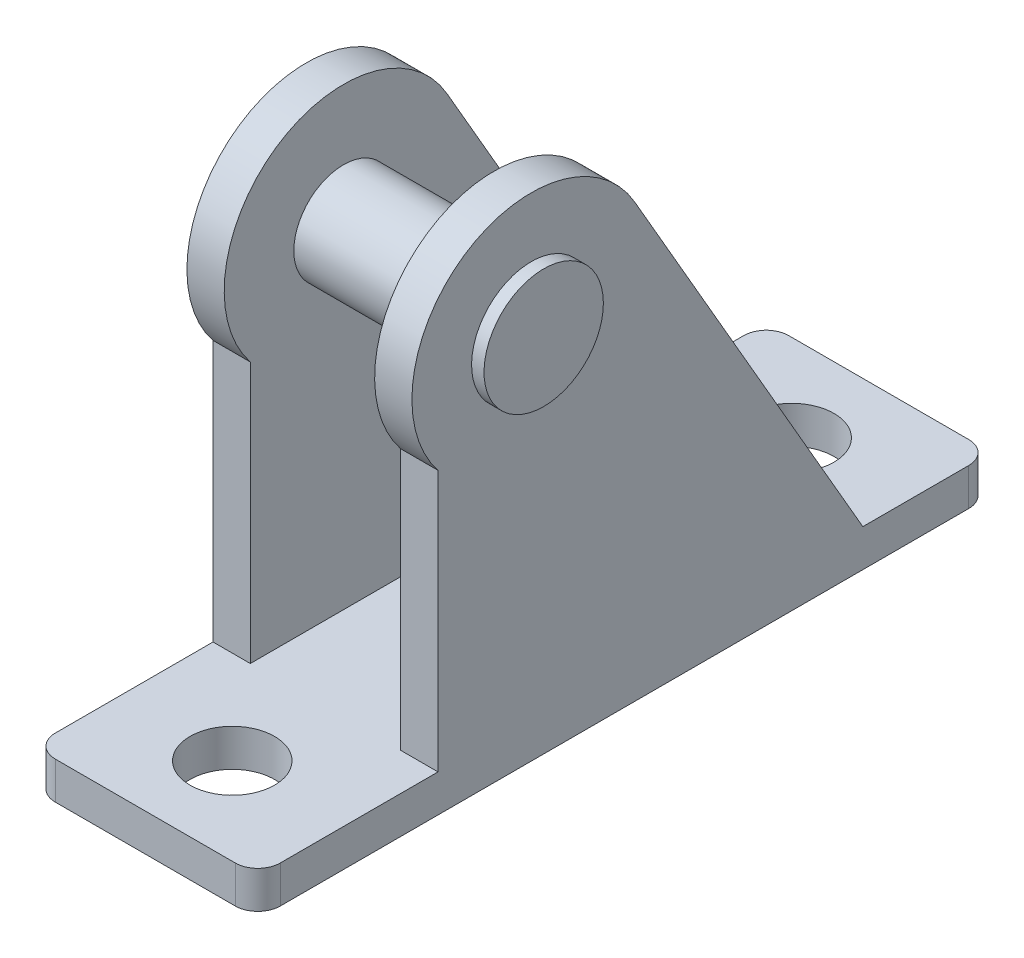
ISO-10303-21;
HEADER;
FILE_DESCRIPTION(('STEP AP214'),'2;1');
FILE_NAME('part.step','',(''),(''),'','','');
FILE_SCHEMA(('AUTOMOTIVE_DESIGN { 1 0 10303 214 1 1 1 1 }'));
ENDSEC;
DATA;
#1=APPLICATION_CONTEXT('core data for automotive mechanical design processes');
#2=APPLICATION_PROTOCOL_DEFINITION('international standard','automotive_design',2000,#1);
#3=PRODUCT_CONTEXT('',#1,'mechanical');
#4=PRODUCT('Part','Part','',(#3));
#5=PRODUCT_RELATED_PRODUCT_CATEGORY('part','',(#4));
#6=PRODUCT_DEFINITION_FORMATION('','',#4);
#7=PRODUCT_DEFINITION_CONTEXT('part definition',#1,'design');
#8=PRODUCT_DEFINITION('design','',#6,#7);
#9=PRODUCT_DEFINITION_SHAPE('','',#8);
#10=(LENGTH_UNIT() NAMED_UNIT(*) SI_UNIT(.MILLI.,.METRE.));
#11=(NAMED_UNIT(*) PLANE_ANGLE_UNIT() SI_UNIT($,.RADIAN.));
#12=(NAMED_UNIT(*) SI_UNIT($,.STERADIAN.) SOLID_ANGLE_UNIT());
#13=UNCERTAINTY_MEASURE_WITH_UNIT(LENGTH_MEASURE(1.E-05),#10,'distance_accuracy_value','');
#14=(GEOMETRIC_REPRESENTATION_CONTEXT(3) GLOBAL_UNCERTAINTY_ASSIGNED_CONTEXT((#13)) GLOBAL_UNIT_ASSIGNED_CONTEXT((#10,
#11,#12)) REPRESENTATION_CONTEXT('',''));
#15=CARTESIAN_POINT('',(0.,0.,0.));
#16=DIRECTION('',(0.,0.,1.));
#17=DIRECTION('',(1.,0.,0.));
#18=AXIS2_PLACEMENT_3D('',#15,#16,#17);
#19=CARTESIAN_POINT('',(9.05,0.,22.));
#20=DIRECTION('',(-1.,0.,0.));
#21=DIRECTION('',(0.,-1.,0.));
#22=AXIS2_PLACEMENT_3D('',#19,#20,#21);
#23=PLANE('',#22);
#24=DIRECTION('',(0.,0.,-1.));
#25=VECTOR('',#24,1.);
#26=CARTESIAN_POINT('',(9.05,0.,22.));
#27=LINE('',#26,#25);
#28=CARTESIAN_POINT('',(9.05,0.,20.19));
#29=VERTEX_POINT('',#28);
#30=CARTESIAN_POINT('',(9.05,0.,-35.19));
#31=VERTEX_POINT('',#30);
#32=EDGE_CURVE('E230',#29,#31,#27,.T.);
#33=ORIENTED_EDGE('',*,*,#32,.T.);
#34=DIRECTION('',(0.,1.,0.));
#35=VECTOR('',#34,1.);
#36=CARTESIAN_POINT('',(9.05,3.,-35.19));
#37=LINE('',#36,#35);
#38=CARTESIAN_POINT('',(9.05,3.,-35.19));
#39=VERTEX_POINT('',#38);
#40=EDGE_CURVE('E270',#31,#39,#37,.T.);
#41=ORIENTED_EDGE('',*,*,#40,.T.);
#42=DIRECTION('',(0.,0.,-1.));
#43=VECTOR('',#42,1.);
#44=CARTESIAN_POINT('',(9.05,3.,-26.6735824365608));
#45=LINE('',#44,#43);
#46=CARTESIAN_POINT('',(9.05,3.,-26.6735824365608));
#47=VERTEX_POINT('',#46);
#48=EDGE_CURVE('E192',#47,#39,#45,.T.);
#49=ORIENTED_EDGE('',*,*,#48,.F.);
#50=DIRECTION('',(0.,-0.866025403784438,-0.500000000000001));
#51=VECTOR('',#50,1.);
#52=CARTESIAN_POINT('',(9.05,34.8,-8.31384387633061));
#53=LINE('',#52,#51);
#54=CARTESIAN_POINT('',(9.05,34.8,-8.31384387633061));
#55=VERTEX_POINT('',#54);
#56=EDGE_CURVE('E189',#55,#47,#53,.T.);
#57=ORIENTED_EDGE('',*,*,#56,.F.);
#58=CARTESIAN_POINT('',(9.05,30.,0.));
#59=DIRECTION('',(-1.,0.,0.));
#60=DIRECTION('',(0.,0.,-1.));
#61=AXIS2_PLACEMENT_3D('',#58,#59,#60);
#62=CIRCLE('',#61,9.6);
#63=CARTESIAN_POINT('',(9.05,24.0075046933685,7.5));
#64=VERTEX_POINT('',#63);
#65=EDGE_CURVE('E186',#64,#55,#62,.T.);
#66=ORIENTED_EDGE('',*,*,#65,.F.);
#67=DIRECTION('',(0.,1.,0.));
#68=VECTOR('',#67,1.);
#69=CARTESIAN_POINT('',(9.05,24.0075046933685,7.5));
#70=LINE('',#69,#68);
#71=CARTESIAN_POINT('',(9.05,3.,7.5));
#72=VERTEX_POINT('',#71);
#73=EDGE_CURVE('E173',#72,#64,#70,.T.);
#74=ORIENTED_EDGE('',*,*,#73,.F.);
#75=DIRECTION('',(0.,0.,-1.));
#76=VECTOR('',#75,1.);
#77=CARTESIAN_POINT('',(9.05,3.,7.5));
#78=LINE('',#77,#76);
#79=CARTESIAN_POINT('',(9.05,3.,20.19));
#80=VERTEX_POINT('',#79);
#81=EDGE_CURVE('E176',#80,#72,#78,.T.);
#82=ORIENTED_EDGE('',*,*,#81,.F.);
#83=DIRECTION('',(0.,1.,0.));
#84=VECTOR('',#83,1.);
#85=CARTESIAN_POINT('',(9.05,0.,20.19));
#86=LINE('',#85,#84);
#87=EDGE_CURVE('E268',#80,#29,#86,.F.);
#88=ORIENTED_EDGE('',*,*,#87,.T.);
#89=EDGE_LOOP('',(#33,#41,#49,#57,#66,#74,#82,#88));
#90=FACE_BOUND('',#89,.T.);
#91=CARTESIAN_POINT('',(9.05,30.,0.));
#92=DIRECTION('',(-1.,0.,0.));
#93=DIRECTION('',(0.,-1.,0.));
#94=AXIS2_PLACEMENT_3D('',#91,#92,#93);
#95=CIRCLE('',#94,4.8);
#96=CARTESIAN_POINT('',(9.05,25.2,0.));
#97=VERTEX_POINT('',#96);
#98=EDGE_CURVE('E242',#97,#97,#95,.F.);
#99=ORIENTED_EDGE('',*,*,#98,.F.);
#100=EDGE_LOOP('',(#99));
#101=FACE_BOUND('',#100,.T.);
#102=ADVANCED_FACE('F32',(#90,#101),#23,.F.);
#103=CARTESIAN_POINT('',(-9.05,0.,22.));
#104=DIRECTION('',(1.,0.,0.));
#105=DIRECTION('',(0.,1.,0.));
#106=AXIS2_PLACEMENT_3D('',#103,#104,#105);
#107=PLANE('',#106);
#108=CARTESIAN_POINT('',(-9.05,30.,0.));
#109=DIRECTION('',(1.,0.,0.));
#110=DIRECTION('',(0.,0.,-1.));
#111=AXIS2_PLACEMENT_3D('',#108,#109,#110);
#112=CIRCLE('',#111,4.8);
#113=CARTESIAN_POINT('',(-9.05,30.,-4.8));
#114=VERTEX_POINT('',#113);
#115=EDGE_CURVE('E559',#114,#114,#112,.T.);
#116=ORIENTED_EDGE('',*,*,#115,.T.);
#117=EDGE_LOOP('',(#116));
#118=FACE_BOUND('',#117,.T.);
#119=DIRECTION('',(0.,0.,-1.));
#120=VECTOR('',#119,1.);
#121=CARTESIAN_POINT('',(-9.05,3.,-26.6735824365608));
#122=LINE('',#121,#120);
#123=CARTESIAN_POINT('',(-9.05,3.,-26.6735824365608));
#124=VERTEX_POINT('',#123);
#125=CARTESIAN_POINT('',(-9.05,3.,-35.19));
#126=VERTEX_POINT('',#125);
#127=EDGE_CURVE('E168',#124,#126,#122,.T.);
#128=ORIENTED_EDGE('',*,*,#127,.T.);
#129=DIRECTION('',(0.,-1.,0.));
#130=VECTOR('',#129,1.);
#131=CARTESIAN_POINT('',(-9.05,0.,-35.19));
#132=LINE('',#131,#130);
#133=CARTESIAN_POINT('',(-9.05,0.,-35.19));
#134=VERTEX_POINT('',#133);
#135=EDGE_CURVE('E247',#126,#134,#132,.T.);
#136=ORIENTED_EDGE('',*,*,#135,.T.);
#137=DIRECTION('',(0.,0.,-1.));
#138=VECTOR('',#137,1.);
#139=CARTESIAN_POINT('',(-9.05,0.,22.));
#140=LINE('',#139,#138);
#141=CARTESIAN_POINT('',(-9.05,0.,20.19));
#142=VERTEX_POINT('',#141);
#143=EDGE_CURVE('E233',#142,#134,#140,.T.);
#144=ORIENTED_EDGE('',*,*,#143,.F.);
#145=DIRECTION('',(0.,-1.,0.));
#146=VECTOR('',#145,1.);
#147=CARTESIAN_POINT('',(-9.05,0.,20.19));
#148=LINE('',#147,#146);
#149=CARTESIAN_POINT('',(-9.05,3.,20.19));
#150=VERTEX_POINT('',#149);
#151=EDGE_CURVE('E245',#142,#150,#148,.F.);
#152=ORIENTED_EDGE('',*,*,#151,.T.);
#153=DIRECTION('',(0.,0.,-1.));
#154=VECTOR('',#153,1.);
#155=CARTESIAN_POINT('',(-9.05,3.,7.5));
#156=LINE('',#155,#154);
#157=CARTESIAN_POINT('',(-9.05,3.,7.5));
#158=VERTEX_POINT('',#157);
#159=EDGE_CURVE('E183',#150,#158,#156,.T.);
#160=ORIENTED_EDGE('',*,*,#159,.T.);
#161=DIRECTION('',(0.,1.,0.));
#162=VECTOR('',#161,1.);
#163=CARTESIAN_POINT('',(-9.05,24.0075046933685,7.5));
#164=LINE('',#163,#162);
#165=CARTESIAN_POINT('',(-9.05,24.0075046933685,7.5));
#166=VERTEX_POINT('',#165);
#167=EDGE_CURVE('E172',#158,#166,#164,.T.);
#168=ORIENTED_EDGE('',*,*,#167,.T.);
#169=CARTESIAN_POINT('',(-9.05,30.,0.));
#170=DIRECTION('',(-1.,0.,0.));
#171=DIRECTION('',(0.,0.,-1.));
#172=AXIS2_PLACEMENT_3D('',#169,#170,#171);
#173=CIRCLE('',#172,9.6);
#174=CARTESIAN_POINT('',(-9.05,34.8,-8.31384387633061));
#175=VERTEX_POINT('',#174);
#176=EDGE_CURVE('E151',#166,#175,#173,.T.);
#177=ORIENTED_EDGE('',*,*,#176,.T.);
#178=DIRECTION('',(0.,-0.866025403784438,-0.500000000000001));
#179=VECTOR('',#178,1.);
#180=CARTESIAN_POINT('',(-9.05,34.8,-8.31384387633061));
#181=LINE('',#180,#179);
#182=EDGE_CURVE('E161',#175,#124,#181,.T.);
#183=ORIENTED_EDGE('',*,*,#182,.T.);
#184=EDGE_LOOP('',(#128,#136,#144,#152,#160,#168,#177,#183));
#185=FACE_BOUND('',#184,.T.);
#186=ADVANCED_FACE('F170',(#118,#185),#107,.F.);
#187=CARTESIAN_POINT('',(-9.05,0.,22.));
#188=DIRECTION('',(0.,1.,0.));
#189=DIRECTION('',(0.,0.,1.));
#190=AXIS2_PLACEMENT_3D('',#187,#188,#189);
#191=PLANE('',#190);
#192=CARTESIAN_POINT('',(0.,0.,-30.));
#193=DIRECTION('',(0.,1.,0.));
#194=DIRECTION('',(0.,0.,1.));
#195=AXIS2_PLACEMENT_3D('',#192,#193,#194);
#196=CIRCLE('',#195,3.4);
#197=CARTESIAN_POINT('',(0.,0.,-26.6));
#198=VERTEX_POINT('',#197);
#199=EDGE_CURVE('E568',#198,#198,#196,.T.);
#200=ORIENTED_EDGE('',*,*,#199,.T.);
#201=EDGE_LOOP('',(#200));
#202=FACE_BOUND('',#201,.T.);
#203=CARTESIAN_POINT('',(0.,0.,15.));
#204=DIRECTION('',(0.,1.,0.));
#205=DIRECTION('',(0.,0.,1.));
#206=AXIS2_PLACEMENT_3D('',#203,#204,#205);
#207=CIRCLE('',#206,3.4);
#208=CARTESIAN_POINT('',(0.,0.,18.4));
#209=VERTEX_POINT('',#208);
#210=EDGE_CURVE('E562',#209,#209,#207,.T.);
#211=ORIENTED_EDGE('',*,*,#210,.T.);
#212=EDGE_LOOP('',(#211));
#213=FACE_BOUND('',#212,.T.);
#214=ORIENTED_EDGE('',*,*,#143,.T.);
#215=CARTESIAN_POINT('',(-7.24,0.,-35.19));
#216=DIRECTION('',(0.,1.,0.));
#217=DIRECTION('',(0.,0.,1.));
#218=AXIS2_PLACEMENT_3D('',#215,#216,#217);
#219=CIRCLE('',#218,1.81);
#220=CARTESIAN_POINT('',(-7.24,0.,-37.));
#221=VERTEX_POINT('',#220);
#222=EDGE_CURVE('E256',#134,#221,#219,.F.);
#223=ORIENTED_EDGE('',*,*,#222,.T.);
#224=DIRECTION('',(1.,0.,0.));
#225=VECTOR('',#224,1.);
#226=CARTESIAN_POINT('',(-9.05,0.,-37.));
#227=LINE('',#226,#225);
#228=CARTESIAN_POINT('',(7.23999999999999,0.,-37.));
#229=VERTEX_POINT('',#228);
#230=EDGE_CURVE('E212',#221,#229,#227,.T.);
#231=ORIENTED_EDGE('',*,*,#230,.T.);
#232=CARTESIAN_POINT('',(7.24,0.,-35.19));
#233=DIRECTION('',(0.,1.,0.));
#234=DIRECTION('',(0.,0.,1.));
#235=AXIS2_PLACEMENT_3D('',#232,#233,#234);
#236=CIRCLE('',#235,1.81);
#237=EDGE_CURVE('E254',#229,#31,#236,.F.);
#238=ORIENTED_EDGE('',*,*,#237,.T.);
#239=ORIENTED_EDGE('',*,*,#32,.F.);
#240=CARTESIAN_POINT('',(7.24,0.,20.19));
#241=DIRECTION('',(0.,1.,0.));
#242=DIRECTION('',(0.,0.,1.));
#243=AXIS2_PLACEMENT_3D('',#240,#241,#242);
#244=CIRCLE('',#243,1.81);
#245=CARTESIAN_POINT('',(7.23999999999999,0.,22.));
#246=VERTEX_POINT('',#245);
#247=EDGE_CURVE('E250',#29,#246,#244,.F.);
#248=ORIENTED_EDGE('',*,*,#247,.T.);
#249=DIRECTION('',(1.,0.,0.));
#250=VECTOR('',#249,1.);
#251=CARTESIAN_POINT('',(-9.05,0.,22.));
#252=LINE('',#251,#250);
#253=CARTESIAN_POINT('',(-7.24,0.,22.));
#254=VERTEX_POINT('',#253);
#255=EDGE_CURVE('E213',#254,#246,#252,.T.);
#256=ORIENTED_EDGE('',*,*,#255,.F.);
#257=CARTESIAN_POINT('',(-7.24,0.,20.19));
#258=DIRECTION('',(0.,1.,0.));
#259=DIRECTION('',(0.,0.,1.));
#260=AXIS2_PLACEMENT_3D('',#257,#258,#259);
#261=CIRCLE('',#260,1.81);
#262=EDGE_CURVE('E252',#254,#142,#261,.F.);
#263=ORIENTED_EDGE('',*,*,#262,.T.);
#264=EDGE_LOOP('',(#214,#223,#231,#238,#239,#248,#256,#263));
#265=FACE_BOUND('',#264,.T.);
#266=ADVANCED_FACE('F287',(#202,#213,#265),#191,.F.);
#267=CARTESIAN_POINT('',(6.05,3.,22.));
#268=DIRECTION('',(1.,0.,0.));
#269=DIRECTION('',(0.,1.,0.));
#270=AXIS2_PLACEMENT_3D('',#267,#268,#269);
#271=PLANE('',#270);
#272=CARTESIAN_POINT('',(6.05000000000001,30.,0.));
#273=DIRECTION('',(1.,0.,0.));
#274=DIRECTION('',(0.,1.,0.));
#275=AXIS2_PLACEMENT_3D('',#272,#273,#274);
#276=CIRCLE('',#275,4.);
#277=CARTESIAN_POINT('',(6.05000000000001,34.,0.));
#278=VERTEX_POINT('',#277);
#279=EDGE_CURVE('E179',#278,#278,#276,.T.);
#280=ORIENTED_EDGE('',*,*,#279,.T.);
#281=EDGE_LOOP('',(#280));
#282=FACE_BOUND('',#281,.T.);
#283=DIRECTION('',(0.,0.,-1.));
#284=VECTOR('',#283,1.);
#285=CARTESIAN_POINT('',(6.05,3.,22.));
#286=LINE('',#285,#284);
#287=CARTESIAN_POINT('',(6.05,3.,7.5));
#288=VERTEX_POINT('',#287);
#289=CARTESIAN_POINT('',(6.05,3.,-26.6735824365608));
#290=VERTEX_POINT('',#289);
#291=EDGE_CURVE('E227',#288,#290,#286,.T.);
#292=ORIENTED_EDGE('',*,*,#291,.F.);
#293=DIRECTION('',(0.,1.,0.));
#294=VECTOR('',#293,1.);
#295=CARTESIAN_POINT('',(6.05,3.,7.5));
#296=LINE('',#295,#294);
#297=CARTESIAN_POINT('',(6.05000000000001,24.0075046933685,7.5));
#298=VERTEX_POINT('',#297);
#299=EDGE_CURVE('E206',#288,#298,#296,.T.);
#300=ORIENTED_EDGE('',*,*,#299,.T.);
#301=CARTESIAN_POINT('',(6.05000000000001,30.,0.));
#302=DIRECTION('',(1.,0.,0.));
#303=DIRECTION('',(0.,1.,0.));
#304=AXIS2_PLACEMENT_3D('',#301,#302,#303);
#305=CIRCLE('',#304,9.6);
#306=CARTESIAN_POINT('',(6.05000000000001,34.8,-8.31384387633061));
#307=VERTEX_POINT('',#306);
#308=EDGE_CURVE('E209',#298,#307,#305,.F.);
#309=ORIENTED_EDGE('',*,*,#308,.T.);
#310=DIRECTION('',(0.,-0.866025403784438,-0.500000000000001));
#311=VECTOR('',#310,1.);
#312=CARTESIAN_POINT('',(6.05000000000001,24.0762794416289,-14.5051868274205));
#313=LINE('',#312,#311);
#314=EDGE_CURVE('E198',#307,#290,#313,.T.);
#315=ORIENTED_EDGE('',*,*,#314,.T.);
#316=EDGE_LOOP('',(#292,#300,#309,#315));
#317=FACE_BOUND('',#316,.T.);
#318=ADVANCED_FACE('F302',(#282,#317),#271,.F.);
#319=CARTESIAN_POINT('',(-6.05,3.,22.));
#320=DIRECTION('',(0.,-1.,0.));
#321=DIRECTION('',(0.,0.,-1.));
#322=AXIS2_PLACEMENT_3D('',#319,#320,#321);
#323=PLANE('',#322);
#324=CARTESIAN_POINT('',(0.,3.,-30.));
#325=DIRECTION('',(0.,1.,0.));
#326=DIRECTION('',(0.,0.,1.));
#327=AXIS2_PLACEMENT_3D('',#324,#325,#326);
#328=CIRCLE('',#327,3.4);
#329=CARTESIAN_POINT('',(0.,3.,-26.6));
#330=VERTEX_POINT('',#329);
#331=EDGE_CURVE('E571',#330,#330,#328,.T.);
#332=ORIENTED_EDGE('',*,*,#331,.F.);
#333=EDGE_LOOP('',(#332));
#334=FACE_BOUND('',#333,.T.);
#335=CARTESIAN_POINT('',(0.,3.,15.));
#336=DIRECTION('',(0.,1.,0.));
#337=DIRECTION('',(0.,0.,1.));
#338=AXIS2_PLACEMENT_3D('',#335,#336,#337);
#339=CIRCLE('',#338,3.4);
#340=CARTESIAN_POINT('',(0.,3.,18.4));
#341=VERTEX_POINT('',#340);
#342=EDGE_CURVE('E565',#341,#341,#339,.T.);
#343=ORIENTED_EDGE('',*,*,#342,.F.);
#344=EDGE_LOOP('',(#343));
#345=FACE_BOUND('',#344,.T.);
#346=DIRECTION('',(-1.,0.,0.));
#347=VECTOR('',#346,1.);
#348=CARTESIAN_POINT('',(-6.05,3.,-37.));
#349=LINE('',#348,#347);
#350=CARTESIAN_POINT('',(7.24,3.,-37.));
#351=VERTEX_POINT('',#350);
#352=CARTESIAN_POINT('',(-7.24,3.,-37.));
#353=VERTEX_POINT('',#352);
#354=EDGE_CURVE('E217',#351,#353,#349,.T.);
#355=ORIENTED_EDGE('',*,*,#354,.T.);
#356=CARTESIAN_POINT('',(-7.24,3.,-35.19));
#357=DIRECTION('',(0.,-1.,0.));
#358=DIRECTION('',(0.,0.,-1.));
#359=AXIS2_PLACEMENT_3D('',#356,#357,#358);
#360=CIRCLE('',#359,1.81);
#361=EDGE_CURVE('E266',#353,#126,#360,.F.);
#362=ORIENTED_EDGE('',*,*,#361,.T.);
#363=ORIENTED_EDGE('',*,*,#127,.F.);
#364=DIRECTION('',(1.,0.,0.));
#365=VECTOR('',#364,1.);
#366=CARTESIAN_POINT('',(-9.05,3.,-26.6735824365608));
#367=LINE('',#366,#365);
#368=CARTESIAN_POINT('',(-6.05,3.,-26.6735824365608));
#369=VERTEX_POINT('',#368);
#370=EDGE_CURVE('E164',#124,#369,#367,.T.);
#371=ORIENTED_EDGE('',*,*,#370,.T.);
#372=DIRECTION('',(0.,0.,-1.));
#373=VECTOR('',#372,1.);
#374=CARTESIAN_POINT('',(-6.05,3.,22.));
#375=LINE('',#374,#373);
#376=CARTESIAN_POINT('',(-6.05,3.,7.5));
#377=VERTEX_POINT('',#376);
#378=EDGE_CURVE('E220',#377,#369,#375,.T.);
#379=ORIENTED_EDGE('',*,*,#378,.F.);
#380=DIRECTION('',(1.,0.,0.));
#381=VECTOR('',#380,1.);
#382=CARTESIAN_POINT('',(-9.05,3.,7.5));
#383=LINE('',#382,#381);
#384=EDGE_CURVE('E200',#158,#377,#383,.T.);
#385=ORIENTED_EDGE('',*,*,#384,.F.);
#386=ORIENTED_EDGE('',*,*,#159,.F.);
#387=CARTESIAN_POINT('',(-7.24,3.,20.19));
#388=DIRECTION('',(0.,-1.,0.));
#389=DIRECTION('',(0.,0.,-1.));
#390=AXIS2_PLACEMENT_3D('',#387,#388,#389);
#391=CIRCLE('',#390,1.81);
#392=CARTESIAN_POINT('',(-7.24,3.,22.));
#393=VERTEX_POINT('',#392);
#394=EDGE_CURVE('E263',#150,#393,#391,.F.);
#395=ORIENTED_EDGE('',*,*,#394,.T.);
#396=DIRECTION('',(-1.,0.,0.));
#397=VECTOR('',#396,1.);
#398=CARTESIAN_POINT('',(-6.05,3.,22.));
#399=LINE('',#398,#397);
#400=CARTESIAN_POINT('',(7.24,3.,22.));
#401=VERTEX_POINT('',#400);
#402=EDGE_CURVE('E216',#401,#393,#399,.T.);
#403=ORIENTED_EDGE('',*,*,#402,.F.);
#404=CARTESIAN_POINT('',(7.24,3.,20.19));
#405=DIRECTION('',(0.,-1.,0.));
#406=DIRECTION('',(0.,0.,-1.));
#407=AXIS2_PLACEMENT_3D('',#404,#405,#406);
#408=CIRCLE('',#407,1.81);
#409=EDGE_CURVE('E55',#401,#80,#408,.F.);
#410=ORIENTED_EDGE('',*,*,#409,.T.);
#411=ORIENTED_EDGE('',*,*,#81,.T.);
#412=EDGE_CURVE('E202',#288,#72,#383,.T.);
#413=ORIENTED_EDGE('',*,*,#412,.F.);
#414=ORIENTED_EDGE('',*,*,#291,.T.);
#415=EDGE_CURVE('E157',#290,#47,#367,.T.);
#416=ORIENTED_EDGE('',*,*,#415,.T.);
#417=ORIENTED_EDGE('',*,*,#48,.T.);
#418=CARTESIAN_POINT('',(7.24,3.,-35.19));
#419=DIRECTION('',(0.,-1.,0.));
#420=DIRECTION('',(0.,0.,-1.));
#421=AXIS2_PLACEMENT_3D('',#418,#419,#420);
#422=CIRCLE('',#421,1.81);
#423=EDGE_CURVE('E47',#39,#351,#422,.F.);
#424=ORIENTED_EDGE('',*,*,#423,.T.);
#425=EDGE_LOOP('',(#355,#362,#363,#371,#379,#385,#386,#395,#403,#410,#411,#413,#414,#416,#417,#424));
#426=FACE_BOUND('',#425,.T.);
#427=ADVANCED_FACE('F279',(#334,#345,#426),#323,.F.);
#428=CARTESIAN_POINT('',(-6.05,3.,22.));
#429=DIRECTION('',(-1.,0.,0.));
#430=DIRECTION('',(0.,-1.,0.));
#431=AXIS2_PLACEMENT_3D('',#428,#429,#430);
#432=PLANE('',#431);
#433=CARTESIAN_POINT('',(-6.05,30.,0.));
#434=DIRECTION('',(-1.,0.,0.));
#435=DIRECTION('',(0.,-1.,0.));
#436=AXIS2_PLACEMENT_3D('',#433,#434,#435);
#437=CIRCLE('',#436,4.);
#438=CARTESIAN_POINT('',(-6.05,26.,0.));
#439=VERTEX_POINT('',#438);
#440=EDGE_CURVE('E552',#439,#439,#437,.F.);
#441=ORIENTED_EDGE('',*,*,#440,.F.);
#442=EDGE_LOOP('',(#441));
#443=FACE_BOUND('',#442,.T.);
#444=CARTESIAN_POINT('',(-6.05,30.,0.));
#445=DIRECTION('',(-1.,0.,0.));
#446=DIRECTION('',(0.,-1.,0.));
#447=AXIS2_PLACEMENT_3D('',#444,#445,#446);
#448=CIRCLE('',#447,9.6);
#449=CARTESIAN_POINT('',(-6.05,34.8,-8.31384387633061));
#450=VERTEX_POINT('',#449);
#451=CARTESIAN_POINT('',(-6.05,24.0075046933685,7.5));
#452=VERTEX_POINT('',#451);
#453=EDGE_CURVE('E154',#450,#452,#448,.F.);
#454=ORIENTED_EDGE('',*,*,#453,.T.);
#455=DIRECTION('',(0.,-1.,0.));
#456=VECTOR('',#455,1.);
#457=CARTESIAN_POINT('',(-6.05,3.,7.5));
#458=LINE('',#457,#456);
#459=EDGE_CURVE('E239',#452,#377,#458,.T.);
#460=ORIENTED_EDGE('',*,*,#459,.T.);
#461=ORIENTED_EDGE('',*,*,#378,.T.);
#462=DIRECTION('',(0.,0.866025403784438,0.500000000000001));
#463=VECTOR('',#462,1.);
#464=CARTESIAN_POINT('',(-6.05,24.0762794416289,-14.5051868274205));
#465=LINE('',#464,#463);
#466=EDGE_CURVE('E236',#369,#450,#465,.T.);
#467=ORIENTED_EDGE('',*,*,#466,.T.);
#468=EDGE_LOOP('',(#454,#460,#461,#467));
#469=FACE_BOUND('',#468,.T.);
#470=ADVANCED_FACE('F323',(#443,#469),#432,.F.);
#471=CARTESIAN_POINT('',(-9.05,40.,22.));
#472=DIRECTION('',(0.,0.,-1.));
#473=DIRECTION('',(-1.,0.,0.));
#474=AXIS2_PLACEMENT_3D('',#471,#472,#473);
#475=PLANE('',#474);
#476=ORIENTED_EDGE('',*,*,#402,.T.);
#477=DIRECTION('',(0.,-1.,0.));
#478=VECTOR('',#477,1.);
#479=CARTESIAN_POINT('',(-7.24,40.,22.));
#480=LINE('',#479,#478);
#481=EDGE_CURVE('E11',#393,#254,#480,.T.);
#482=ORIENTED_EDGE('',*,*,#481,.T.);
#483=ORIENTED_EDGE('',*,*,#255,.T.);
#484=DIRECTION('',(0.,1.,0.));
#485=VECTOR('',#484,1.);
#486=CARTESIAN_POINT('',(7.24,40.,22.));
#487=LINE('',#486,#485);
#488=EDGE_CURVE('E40',#246,#401,#487,.T.);
#489=ORIENTED_EDGE('',*,*,#488,.T.);
#490=EDGE_LOOP('',(#476,#482,#483,#489));
#491=FACE_BOUND('',#490,.T.);
#492=ADVANCED_FACE('F274',(#491),#475,.F.);
#493=CARTESIAN_POINT('',(-9.05,40.,-37.));
#494=DIRECTION('',(0.,0.,-1.));
#495=DIRECTION('',(-1.,0.,0.));
#496=AXIS2_PLACEMENT_3D('',#493,#494,#495);
#497=PLANE('',#496);
#498=ORIENTED_EDGE('',*,*,#230,.F.);
#499=DIRECTION('',(0.,-1.,0.));
#500=VECTOR('',#499,1.);
#501=CARTESIAN_POINT('',(-7.24,3.,-37.));
#502=LINE('',#501,#500);
#503=EDGE_CURVE('E260',#221,#353,#502,.F.);
#504=ORIENTED_EDGE('',*,*,#503,.T.);
#505=ORIENTED_EDGE('',*,*,#354,.F.);
#506=DIRECTION('',(0.,1.,0.));
#507=VECTOR('',#506,1.);
#508=CARTESIAN_POINT('',(7.24,0.,-37.));
#509=LINE('',#508,#507);
#510=EDGE_CURVE('E258',#351,#229,#509,.F.);
#511=ORIENTED_EDGE('',*,*,#510,.T.);
#512=EDGE_LOOP('',(#498,#504,#505,#511));
#513=FACE_BOUND('',#512,.T.);
#514=ADVANCED_FACE('F313',(#513),#497,.T.);
#515=CARTESIAN_POINT('',(-9.05,24.0075046933685,7.5));
#516=DIRECTION('',(0.,0.,-1.));
#517=DIRECTION('',(0.,1.,0.));
#518=AXIS2_PLACEMENT_3D('',#515,#516,#517);
#519=PLANE('',#518);
#520=DIRECTION('',(1.,0.,0.));
#521=VECTOR('',#520,1.);
#522=CARTESIAN_POINT('',(-9.05,24.0075046933685,7.5));
#523=LINE('',#522,#521);
#524=EDGE_CURVE('E196',#166,#452,#523,.T.);
#525=ORIENTED_EDGE('',*,*,#524,.F.);
#526=ORIENTED_EDGE('',*,*,#167,.F.);
#527=ORIENTED_EDGE('',*,*,#384,.T.);
#528=ORIENTED_EDGE('',*,*,#459,.F.);
#529=EDGE_LOOP('',(#525,#526,#527,#528));
#530=FACE_BOUND('',#529,.T.);
#531=ADVANCED_FACE('F321',(#530),#519,.F.);
#532=CARTESIAN_POINT('',(-9.05,34.8,-8.31384387633061));
#533=DIRECTION('',(0.,-0.500000000000001,0.866025403784438));
#534=DIRECTION('',(0.,-0.866025403784438,-0.500000000000001));
#535=AXIS2_PLACEMENT_3D('',#532,#533,#534);
#536=PLANE('',#535);
#537=ORIENTED_EDGE('',*,*,#370,.F.);
#538=ORIENTED_EDGE('',*,*,#182,.F.);
#539=DIRECTION('',(1.,0.,0.));
#540=VECTOR('',#539,1.);
#541=CARTESIAN_POINT('',(-9.05,34.8,-8.31384387633061));
#542=LINE('',#541,#540);
#543=EDGE_CURVE('E146',#175,#450,#542,.T.);
#544=ORIENTED_EDGE('',*,*,#543,.T.);
#545=ORIENTED_EDGE('',*,*,#466,.F.);
#546=EDGE_LOOP('',(#537,#538,#544,#545));
#547=FACE_BOUND('',#546,.T.);
#548=ADVANCED_FACE('F162',(#547),#536,.F.);
#549=CARTESIAN_POINT('',(-9.05,30.,0.));
#550=DIRECTION('',(1.,0.,0.));
#551=DIRECTION('',(0.,0.,-1.));
#552=AXIS2_PLACEMENT_3D('',#549,#550,#551);
#553=CYLINDRICAL_SURFACE('',#552,9.6);
#554=ORIENTED_EDGE('',*,*,#543,.F.);
#555=ORIENTED_EDGE('',*,*,#176,.F.);
#556=ORIENTED_EDGE('',*,*,#524,.T.);
#557=ORIENTED_EDGE('',*,*,#453,.F.);
#558=EDGE_LOOP('',(#554,#555,#556,#557));
#559=FACE_BOUND('',#558,.T.);
#560=ADVANCED_FACE('F148',(#559),#553,.T.);
#561=EDGE_CURVE('E199',#298,#64,#523,.T.);
#562=ORIENTED_EDGE('',*,*,#561,.T.);
#563=ORIENTED_EDGE('',*,*,#65,.T.);
#564=EDGE_CURVE('E158',#307,#55,#542,.T.);
#565=ORIENTED_EDGE('',*,*,#564,.F.);
#566=ORIENTED_EDGE('',*,*,#308,.F.);
#567=EDGE_LOOP('',(#562,#563,#565,#566));
#568=FACE_BOUND('',#567,.T.);
#569=ADVANCED_FACE('F392',(#568),#553,.T.);
#570=ORIENTED_EDGE('',*,*,#412,.T.);
#571=ORIENTED_EDGE('',*,*,#73,.T.);
#572=ORIENTED_EDGE('',*,*,#561,.F.);
#573=ORIENTED_EDGE('',*,*,#299,.F.);
#574=EDGE_LOOP('',(#570,#571,#572,#573));
#575=FACE_BOUND('',#574,.T.);
#576=ADVANCED_FACE('F299',(#575),#519,.F.);
#577=ORIENTED_EDGE('',*,*,#564,.T.);
#578=ORIENTED_EDGE('',*,*,#56,.T.);
#579=ORIENTED_EDGE('',*,*,#415,.F.);
#580=ORIENTED_EDGE('',*,*,#314,.F.);
#581=EDGE_LOOP('',(#577,#578,#579,#580));
#582=FACE_BOUND('',#581,.T.);
#583=ADVANCED_FACE('F306',(#582),#536,.F.);
#584=CARTESIAN_POINT('',(-17.3637084989848,30.,0.));
#585=DIRECTION('',(1.,0.,0.));
#586=DIRECTION('',(0.,0.,-1.));
#587=AXIS2_PLACEMENT_3D('',#584,#585,#586);
#588=CYLINDRICAL_SURFACE('',#587,4.);
#589=ORIENTED_EDGE('',*,*,#440,.T.);
#590=EDGE_LOOP('',(#589));
#591=FACE_BOUND('',#590,.T.);
#592=ORIENTED_EDGE('',*,*,#279,.F.);
#593=EDGE_LOOP('',(#592));
#594=FACE_BOUND('',#593,.T.);
#595=ADVANCED_FACE('F385',(#591,#594),#588,.T.);
#596=CARTESIAN_POINT('',(10.05,30.,0.));
#597=DIRECTION('',(-1.,0.,0.));
#598=DIRECTION('',(0.,0.,1.));
#599=AXIS2_PLACEMENT_3D('',#596,#597,#598);
#600=CYLINDRICAL_SURFACE('',#599,4.8);
#601=CARTESIAN_POINT('',(10.05,30.,0.));
#602=DIRECTION('',(1.,0.,0.));
#603=DIRECTION('',(0.,0.,-1.));
#604=AXIS2_PLACEMENT_3D('',#601,#602,#603);
#605=CIRCLE('',#604,4.8);
#606=CARTESIAN_POINT('',(10.05,30.,-4.8));
#607=VERTEX_POINT('',#606);
#608=EDGE_CURVE('E554',#607,#607,#605,.T.);
#609=ORIENTED_EDGE('',*,*,#608,.F.);
#610=EDGE_LOOP('',(#609));
#611=FACE_BOUND('',#610,.T.);
#612=ORIENTED_EDGE('',*,*,#98,.T.);
#613=EDGE_LOOP('',(#612));
#614=FACE_BOUND('',#613,.T.);
#615=ADVANCED_FACE('F381',(#611,#614),#600,.T.);
#616=CARTESIAN_POINT('',(10.05,30.,0.));
#617=DIRECTION('',(1.,0.,0.));
#618=DIRECTION('',(0.,0.,-1.));
#619=AXIS2_PLACEMENT_3D('',#616,#617,#618);
#620=PLANE('',#619);
#621=ORIENTED_EDGE('',*,*,#608,.T.);
#622=EDGE_LOOP('',(#621));
#623=FACE_BOUND('',#622,.T.);
#624=ADVANCED_FACE('F377',(#623),#620,.T.);
#625=CARTESIAN_POINT('',(-10.05,30.,0.));
#626=DIRECTION('',(1.,0.,0.));
#627=DIRECTION('',(0.,0.,-1.));
#628=AXIS2_PLACEMENT_3D('',#625,#626,#627);
#629=CYLINDRICAL_SURFACE('',#628,4.8);
#630=CARTESIAN_POINT('',(-10.05,30.,0.));
#631=DIRECTION('',(1.,0.,0.));
#632=DIRECTION('',(0.,0.,-1.));
#633=AXIS2_PLACEMENT_3D('',#630,#631,#632);
#634=CIRCLE('',#633,4.8);
#635=CARTESIAN_POINT('',(-10.05,30.,-4.8));
#636=VERTEX_POINT('',#635);
#637=EDGE_CURVE('E556',#636,#636,#634,.T.);
#638=ORIENTED_EDGE('',*,*,#637,.T.);
#639=EDGE_LOOP('',(#638));
#640=FACE_BOUND('',#639,.T.);
#641=ORIENTED_EDGE('',*,*,#115,.F.);
#642=EDGE_LOOP('',(#641));
#643=FACE_BOUND('',#642,.T.);
#644=ADVANCED_FACE('F373',(#640,#643),#629,.T.);
#645=CARTESIAN_POINT('',(-10.05,30.,0.));
#646=DIRECTION('',(-1.,0.,0.));
#647=DIRECTION('',(0.,0.,-1.));
#648=AXIS2_PLACEMENT_3D('',#645,#646,#647);
#649=PLANE('',#648);
#650=ORIENTED_EDGE('',*,*,#637,.F.);
#651=EDGE_LOOP('',(#650));
#652=FACE_BOUND('',#651,.T.);
#653=ADVANCED_FACE('F350',(#652),#649,.T.);
#654=CARTESIAN_POINT('',(-7.24,0.,-35.19));
#655=DIRECTION('',(0.,1.,0.));
#656=DIRECTION('',(-1.,0.,0.));
#657=AXIS2_PLACEMENT_3D('',#654,#655,#656);
#658=CYLINDRICAL_SURFACE('',#657,1.81);
#659=ORIENTED_EDGE('',*,*,#361,.F.);
#660=ORIENTED_EDGE('',*,*,#503,.F.);
#661=ORIENTED_EDGE('',*,*,#222,.F.);
#662=ORIENTED_EDGE('',*,*,#135,.F.);
#663=EDGE_LOOP('',(#659,#660,#661,#662));
#664=FACE_BOUND('',#663,.T.);
#665=ADVANCED_FACE('F317',(#664),#658,.T.);
#666=CARTESIAN_POINT('',(7.24,0.,-35.19));
#667=DIRECTION('',(0.,-1.,0.));
#668=DIRECTION('',(1.,0.,0.));
#669=AXIS2_PLACEMENT_3D('',#666,#667,#668);
#670=CYLINDRICAL_SURFACE('',#669,1.81);
#671=ORIENTED_EDGE('',*,*,#237,.F.);
#672=ORIENTED_EDGE('',*,*,#510,.F.);
#673=ORIENTED_EDGE('',*,*,#423,.F.);
#674=ORIENTED_EDGE('',*,*,#40,.F.);
#675=EDGE_LOOP('',(#671,#672,#673,#674));
#676=FACE_BOUND('',#675,.T.);
#677=ADVANCED_FACE('F309',(#676),#670,.T.);
#678=CARTESIAN_POINT('',(-7.24,40.,20.19));
#679=DIRECTION('',(0.,-1.,0.));
#680=DIRECTION('',(1.,0.,0.));
#681=AXIS2_PLACEMENT_3D('',#678,#679,#680);
#682=CYLINDRICAL_SURFACE('',#681,1.81);
#683=ORIENTED_EDGE('',*,*,#394,.F.);
#684=ORIENTED_EDGE('',*,*,#151,.F.);
#685=ORIENTED_EDGE('',*,*,#262,.F.);
#686=ORIENTED_EDGE('',*,*,#481,.F.);
#687=EDGE_LOOP('',(#683,#684,#685,#686));
#688=FACE_BOUND('',#687,.T.);
#689=ADVANCED_FACE('F285',(#688),#682,.T.);
#690=CARTESIAN_POINT('',(7.24,40.,20.19));
#691=DIRECTION('',(0.,1.,0.));
#692=DIRECTION('',(-1.,0.,0.));
#693=AXIS2_PLACEMENT_3D('',#690,#691,#692);
#694=CYLINDRICAL_SURFACE('',#693,1.81);
#695=ORIENTED_EDGE('',*,*,#247,.F.);
#696=ORIENTED_EDGE('',*,*,#87,.F.);
#697=ORIENTED_EDGE('',*,*,#409,.F.);
#698=ORIENTED_EDGE('',*,*,#488,.F.);
#699=EDGE_LOOP('',(#695,#696,#697,#698));
#700=FACE_BOUND('',#699,.T.);
#701=ADVANCED_FACE('F34',(#700),#694,.T.);
#702=CARTESIAN_POINT('',(0.,0.,15.));
#703=DIRECTION('',(0.,1.,0.));
#704=DIRECTION('',(0.,0.,1.));
#705=AXIS2_PLACEMENT_3D('',#702,#703,#704);
#706=CYLINDRICAL_SURFACE('',#705,3.4);
#707=ORIENTED_EDGE('',*,*,#210,.F.);
#708=EDGE_LOOP('',(#707));
#709=FACE_BOUND('',#708,.T.);
#710=ORIENTED_EDGE('',*,*,#342,.T.);
#711=EDGE_LOOP('',(#710));
#712=FACE_BOUND('',#711,.T.);
#713=ADVANCED_FACE('F356',(#709,#712),#706,.F.);
#714=CARTESIAN_POINT('',(0.,0.,-30.));
#715=DIRECTION('',(0.,1.,0.));
#716=DIRECTION('',(0.,0.,1.));
#717=AXIS2_PLACEMENT_3D('',#714,#715,#716);
#718=CYLINDRICAL_SURFACE('',#717,3.4);
#719=ORIENTED_EDGE('',*,*,#199,.F.);
#720=EDGE_LOOP('',(#719));
#721=FACE_BOUND('',#720,.T.);
#722=ORIENTED_EDGE('',*,*,#331,.T.);
#723=EDGE_LOOP('',(#722));
#724=FACE_BOUND('',#723,.T.);
#725=ADVANCED_FACE('F360',(#721,#724),#718,.F.);
#726=CLOSED_SHELL('',(#102,#186,#266,#318,#427,#470,#492,#514,#531,#548,#560,#569,#576,#583,
#595,#615,#624,#644,#653,#665,#677,#689,#701,#713,#725));
#727=MANIFOLD_SOLID_BREP('B2',#726);
#728=ADVANCED_BREP_SHAPE_REPRESENTATION('',(#18,#727),#14);
#729=SHAPE_DEFINITION_REPRESENTATION(#9,#728);
ENDSEC;
END-ISO-10303-21;
